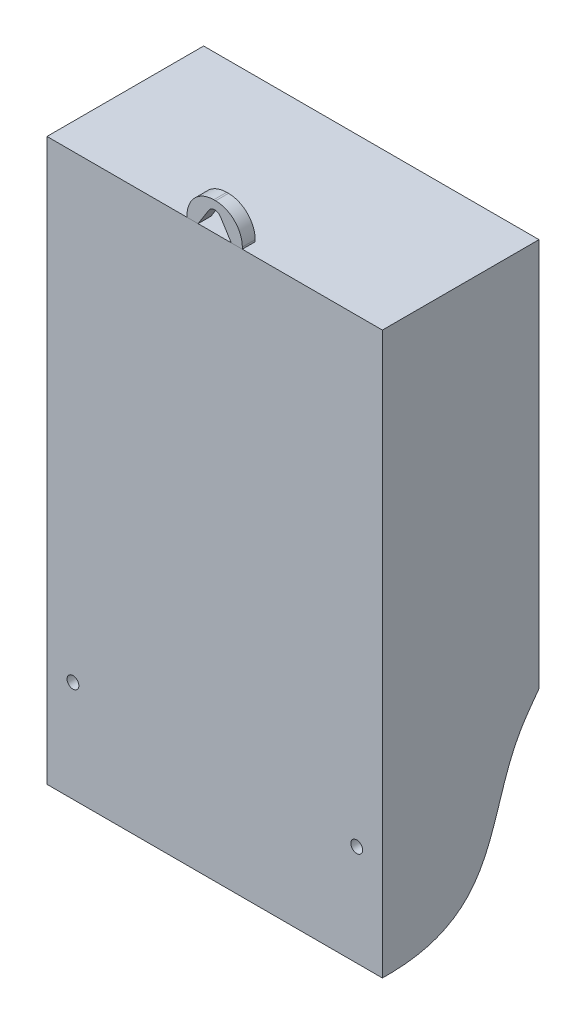
ISO-10303-21;
HEADER;
FILE_DESCRIPTION(('STEP AP214'),'2;1');
FILE_NAME('part.step','',(''),(''),'','','');
FILE_SCHEMA(('AUTOMOTIVE_DESIGN { 1 0 10303 214 1 1 1 1 }'));
ENDSEC;
DATA;
#1=APPLICATION_CONTEXT('core data for automotive mechanical design processes');
#2=APPLICATION_PROTOCOL_DEFINITION('international standard','automotive_design',2000,#1);
#3=PRODUCT_CONTEXT('',#1,'mechanical');
#4=PRODUCT('Part','Part','',(#3));
#5=PRODUCT_RELATED_PRODUCT_CATEGORY('part','',(#4));
#6=PRODUCT_DEFINITION_FORMATION('','',#4);
#7=PRODUCT_DEFINITION_CONTEXT('part definition',#1,'design');
#8=PRODUCT_DEFINITION('design','',#6,#7);
#9=PRODUCT_DEFINITION_SHAPE('','',#8);
#10=(LENGTH_UNIT() NAMED_UNIT(*) SI_UNIT(.MILLI.,.METRE.));
#11=(NAMED_UNIT(*) PLANE_ANGLE_UNIT() SI_UNIT($,.RADIAN.));
#12=(NAMED_UNIT(*) SI_UNIT($,.STERADIAN.) SOLID_ANGLE_UNIT());
#13=UNCERTAINTY_MEASURE_WITH_UNIT(LENGTH_MEASURE(1.E-05),#10,'distance_accuracy_value','');
#14=(GEOMETRIC_REPRESENTATION_CONTEXT(3) GLOBAL_UNCERTAINTY_ASSIGNED_CONTEXT((#13)) GLOBAL_UNIT_ASSIGNED_CONTEXT((#10,
#11,#12)) REPRESENTATION_CONTEXT('',''));
#15=CARTESIAN_POINT('',(0.,0.,0.));
#16=DIRECTION('',(0.,0.,1.));
#17=DIRECTION('',(1.,0.,0.));
#18=AXIS2_PLACEMENT_3D('',#15,#16,#17);
#19=CARTESIAN_POINT('',(-15.,152.25,78.));
#20=DIRECTION('',(0.,-1.,0.));
#21=DIRECTION('',(1.,0.,0.));
#22=AXIS2_PLACEMENT_3D('',#19,#20,#21);
#23=PLANE('',#22);
#24=DIRECTION('',(1.,0.,0.));
#25=VECTOR('',#24,1.);
#26=CARTESIAN_POINT('',(-15.,152.25,85.));
#27=LINE('',#26,#25);
#28=CARTESIAN_POINT('',(-15.,152.25,85.));
#29=VERTEX_POINT('',#28);
#30=CARTESIAN_POINT('',(-9.,152.25,85.));
#31=VERTEX_POINT('',#30);
#32=EDGE_CURVE('E162',#29,#31,#27,.T.);
#33=ORIENTED_EDGE('',*,*,#32,.F.);
#34=DIRECTION('',(0.,0.,1.));
#35=VECTOR('',#34,1.);
#36=CARTESIAN_POINT('',(-15.,152.25,78.));
#37=LINE('',#36,#35);
#38=CARTESIAN_POINT('',(-15.,152.25,78.));
#39=VERTEX_POINT('',#38);
#40=EDGE_CURVE('E12',#39,#29,#37,.T.);
#41=ORIENTED_EDGE('',*,*,#40,.F.);
#42=DIRECTION('',(1.,0.,0.));
#43=VECTOR('',#42,1.);
#44=CARTESIAN_POINT('',(-15.,152.25,78.));
#45=LINE('',#44,#43);
#46=CARTESIAN_POINT('',(-9.,152.25,78.));
#47=VERTEX_POINT('',#46);
#48=EDGE_CURVE('E188',#39,#47,#45,.T.);
#49=ORIENTED_EDGE('',*,*,#48,.T.);
#50=DIRECTION('',(0.,0.,1.));
#51=VECTOR('',#50,1.);
#52=CARTESIAN_POINT('',(-9.,152.25,78.));
#53=LINE('',#52,#51);
#54=EDGE_CURVE('E56',#47,#31,#53,.T.);
#55=ORIENTED_EDGE('',*,*,#54,.T.);
#56=EDGE_LOOP('',(#33,#41,#49,#55));
#57=FACE_BOUND('',#56,.T.);
#58=ADVANCED_FACE('F53',(#57),#23,.T.);
#59=CARTESIAN_POINT('',(-15.,153.25,78.));
#60=DIRECTION('',(-1.,0.,0.));
#61=DIRECTION('',(0.,0.,1.));
#62=AXIS2_PLACEMENT_3D('',#59,#60,#61);
#63=PLANE('',#62);
#64=DIRECTION('',(0.,-1.,0.));
#65=VECTOR('',#64,1.);
#66=CARTESIAN_POINT('',(-15.,153.25,85.));
#67=LINE('',#66,#65);
#68=CARTESIAN_POINT('',(-15.,153.25,85.));
#69=VERTEX_POINT('',#68);
#70=EDGE_CURVE('E186',#69,#29,#67,.T.);
#71=ORIENTED_EDGE('',*,*,#70,.F.);
#72=DIRECTION('',(0.,0.,1.));
#73=VECTOR('',#72,1.);
#74=CARTESIAN_POINT('',(-15.,153.25,78.));
#75=LINE('',#74,#73);
#76=CARTESIAN_POINT('',(-15.,153.25,78.));
#77=VERTEX_POINT('',#76);
#78=EDGE_CURVE('E62',#77,#69,#75,.T.);
#79=ORIENTED_EDGE('',*,*,#78,.F.);
#80=DIRECTION('',(0.,-1.,0.));
#81=VECTOR('',#80,1.);
#82=CARTESIAN_POINT('',(-15.,153.25,78.));
#83=LINE('',#82,#81);
#84=EDGE_CURVE('E152',#77,#39,#83,.T.);
#85=ORIENTED_EDGE('',*,*,#84,.T.);
#86=ORIENTED_EDGE('',*,*,#40,.T.);
#87=EDGE_LOOP('',(#71,#79,#85,#86));
#88=FACE_BOUND('',#87,.T.);
#89=ADVANCED_FACE('F204',(#88),#63,.T.);
#90=CARTESIAN_POINT('',(-0.499999999999999,153.25,78.));
#91=DIRECTION('',(0.,0.,1.));
#92=DIRECTION('',(1.,0.,0.));
#93=AXIS2_PLACEMENT_3D('',#90,#91,#92);
#94=CYLINDRICAL_SURFACE('',#93,14.5);
#95=CARTESIAN_POINT('',(-0.499999999999999,153.25,85.));
#96=DIRECTION('',(0.,0.,1.));
#97=DIRECTION('',(-1.,0.,0.));
#98=AXIS2_PLACEMENT_3D('',#95,#96,#97);
#99=CIRCLE('',#98,14.5);
#100=CARTESIAN_POINT('',(-0.499999999999897,167.75,85.));
#101=VERTEX_POINT('',#100);
#102=EDGE_CURVE('E139',#101,#69,#99,.T.);
#103=ORIENTED_EDGE('',*,*,#102,.F.);
#104=DIRECTION('',(0.,0.,1.));
#105=VECTOR('',#104,1.);
#106=CARTESIAN_POINT('',(-0.499999999999897,167.75,78.));
#107=LINE('',#106,#105);
#108=CARTESIAN_POINT('',(-0.499999999999897,167.75,78.));
#109=VERTEX_POINT('',#108);
#110=EDGE_CURVE('E134',#109,#101,#107,.T.);
#111=ORIENTED_EDGE('',*,*,#110,.F.);
#112=CARTESIAN_POINT('',(-0.499999999999999,153.25,78.));
#113=DIRECTION('',(0.,0.,1.));
#114=DIRECTION('',(-1.,0.,0.));
#115=AXIS2_PLACEMENT_3D('',#112,#113,#114);
#116=CIRCLE('',#115,14.5);
#117=EDGE_CURVE('E137',#109,#77,#116,.T.);
#118=ORIENTED_EDGE('',*,*,#117,.T.);
#119=ORIENTED_EDGE('',*,*,#78,.T.);
#120=EDGE_LOOP('',(#103,#111,#118,#119));
#121=FACE_BOUND('',#120,.T.);
#122=ADVANCED_FACE('F136',(#121),#94,.T.);
#123=CARTESIAN_POINT('',(0.499999999999896,167.75,78.));
#124=DIRECTION('',(0.,1.,0.));
#125=DIRECTION('',(0.,0.,1.));
#126=AXIS2_PLACEMENT_3D('',#123,#124,#125);
#127=PLANE('',#126);
#128=DIRECTION('',(-1.,0.,0.));
#129=VECTOR('',#128,1.);
#130=CARTESIAN_POINT('',(0.499999999999896,167.75,85.));
#131=LINE('',#130,#129);
#132=CARTESIAN_POINT('',(0.499999999999896,167.75,85.));
#133=VERTEX_POINT('',#132);
#134=EDGE_CURVE('E183',#133,#101,#131,.T.);
#135=ORIENTED_EDGE('',*,*,#134,.F.);
#136=DIRECTION('',(0.,0.,1.));
#137=VECTOR('',#136,1.);
#138=CARTESIAN_POINT('',(0.499999999999896,167.75,78.));
#139=LINE('',#138,#137);
#140=CARTESIAN_POINT('',(0.499999999999896,167.75,78.));
#141=VERTEX_POINT('',#140);
#142=EDGE_CURVE('E144',#141,#133,#139,.T.);
#143=ORIENTED_EDGE('',*,*,#142,.F.);
#144=DIRECTION('',(-1.,0.,0.));
#145=VECTOR('',#144,1.);
#146=CARTESIAN_POINT('',(0.499999999999896,167.75,78.));
#147=LINE('',#146,#145);
#148=EDGE_CURVE('E150',#141,#109,#147,.T.);
#149=ORIENTED_EDGE('',*,*,#148,.T.);
#150=ORIENTED_EDGE('',*,*,#110,.T.);
#151=EDGE_LOOP('',(#135,#143,#149,#150));
#152=FACE_BOUND('',#151,.T.);
#153=ADVANCED_FACE('F154',(#152),#127,.T.);
#154=CARTESIAN_POINT('',(0.499999999999999,153.25,78.));
#155=DIRECTION('',(0.,0.,1.));
#156=DIRECTION('',(1.,0.,0.));
#157=AXIS2_PLACEMENT_3D('',#154,#155,#156);
#158=CYLINDRICAL_SURFACE('',#157,14.5);
#159=CARTESIAN_POINT('',(0.499999999999999,153.25,85.));
#160=DIRECTION('',(0.,0.,1.));
#161=DIRECTION('',(1.,0.,0.));
#162=AXIS2_PLACEMENT_3D('',#159,#160,#161);
#163=CIRCLE('',#162,14.5);
#164=CARTESIAN_POINT('',(15.,153.25,85.));
#165=VERTEX_POINT('',#164);
#166=EDGE_CURVE('E180',#165,#133,#163,.T.);
#167=ORIENTED_EDGE('',*,*,#166,.F.);
#168=DIRECTION('',(0.,0.,1.));
#169=VECTOR('',#168,1.);
#170=CARTESIAN_POINT('',(15.,153.25,78.));
#171=LINE('',#170,#169);
#172=CARTESIAN_POINT('',(15.,153.25,78.));
#173=VERTEX_POINT('',#172);
#174=EDGE_CURVE('E192',#173,#165,#171,.T.);
#175=ORIENTED_EDGE('',*,*,#174,.F.);
#176=CARTESIAN_POINT('',(0.499999999999999,153.25,78.));
#177=DIRECTION('',(0.,0.,1.));
#178=DIRECTION('',(1.,0.,0.));
#179=AXIS2_PLACEMENT_3D('',#176,#177,#178);
#180=CIRCLE('',#179,14.5);
#181=EDGE_CURVE('E155',#173,#141,#180,.T.);
#182=ORIENTED_EDGE('',*,*,#181,.T.);
#183=ORIENTED_EDGE('',*,*,#142,.T.);
#184=EDGE_LOOP('',(#167,#175,#182,#183));
#185=FACE_BOUND('',#184,.T.);
#186=ADVANCED_FACE('F217',(#185),#158,.T.);
#187=CARTESIAN_POINT('',(15.,153.25,78.));
#188=DIRECTION('',(1.,0.,0.));
#189=DIRECTION('',(0.,0.,-1.));
#190=AXIS2_PLACEMENT_3D('',#187,#188,#189);
#191=PLANE('',#190);
#192=DIRECTION('',(0.,1.,0.));
#193=VECTOR('',#192,1.);
#194=CARTESIAN_POINT('',(15.,153.25,85.));
#195=LINE('',#194,#193);
#196=CARTESIAN_POINT('',(15.,152.25,85.));
#197=VERTEX_POINT('',#196);
#198=EDGE_CURVE('E177',#197,#165,#195,.T.);
#199=ORIENTED_EDGE('',*,*,#198,.F.);
#200=DIRECTION('',(0.,0.,1.));
#201=VECTOR('',#200,1.);
#202=CARTESIAN_POINT('',(15.,152.25,78.));
#203=LINE('',#202,#201);
#204=CARTESIAN_POINT('',(15.,152.25,78.));
#205=VERTEX_POINT('',#204);
#206=EDGE_CURVE('E194',#205,#197,#203,.T.);
#207=ORIENTED_EDGE('',*,*,#206,.F.);
#208=DIRECTION('',(0.,1.,0.));
#209=VECTOR('',#208,1.);
#210=CARTESIAN_POINT('',(15.,153.25,78.));
#211=LINE('',#210,#209);
#212=EDGE_CURVE('E157',#205,#173,#211,.T.);
#213=ORIENTED_EDGE('',*,*,#212,.T.);
#214=ORIENTED_EDGE('',*,*,#174,.T.);
#215=EDGE_LOOP('',(#199,#207,#213,#214));
#216=FACE_BOUND('',#215,.T.);
#217=ADVANCED_FACE('F220',(#216),#191,.T.);
#218=CARTESIAN_POINT('',(15.,152.25,78.));
#219=DIRECTION('',(0.,-1.,0.));
#220=DIRECTION('',(1.,0.,0.));
#221=AXIS2_PLACEMENT_3D('',#218,#219,#220);
#222=PLANE('',#221);
#223=DIRECTION('',(1.,0.,0.));
#224=VECTOR('',#223,1.);
#225=CARTESIAN_POINT('',(15.,152.25,85.));
#226=LINE('',#225,#224);
#227=CARTESIAN_POINT('',(9.,152.25,85.));
#228=VERTEX_POINT('',#227);
#229=EDGE_CURVE('E174',#228,#197,#226,.T.);
#230=ORIENTED_EDGE('',*,*,#229,.F.);
#231=DIRECTION('',(0.,0.,1.));
#232=VECTOR('',#231,1.);
#233=CARTESIAN_POINT('',(9.,152.25,78.));
#234=LINE('',#233,#232);
#235=CARTESIAN_POINT('',(9.,152.25,78.));
#236=VERTEX_POINT('',#235);
#237=EDGE_CURVE('E196',#236,#228,#234,.T.);
#238=ORIENTED_EDGE('',*,*,#237,.F.);
#239=DIRECTION('',(1.,0.,0.));
#240=VECTOR('',#239,1.);
#241=CARTESIAN_POINT('',(15.,152.25,78.));
#242=LINE('',#241,#240);
#243=EDGE_CURVE('E295',#236,#205,#242,.T.);
#244=ORIENTED_EDGE('',*,*,#243,.T.);
#245=ORIENTED_EDGE('',*,*,#206,.T.);
#246=EDGE_LOOP('',(#230,#238,#244,#245));
#247=FACE_BOUND('',#246,.T.);
#248=ADVANCED_FACE('F224',(#247),#222,.T.);
#249=CARTESIAN_POINT('',(9.,152.25,78.));
#250=DIRECTION('',(-0.846076857429282,-0.533060926463936,0.));
#251=DIRECTION('',(0.533060926463936,-0.846076857429282,0.));
#252=AXIS2_PLACEMENT_3D('',#249,#250,#251);
#253=PLANE('',#252);
#254=DIRECTION('',(0.533060926463936,-0.846076857429282,0.));
#255=VECTOR('',#254,1.);
#256=CARTESIAN_POINT('',(9.,152.25,85.));
#257=LINE('',#256,#255);
#258=CARTESIAN_POINT('',(3.17278821535982,161.49897847424,85.));
#259=VERTEX_POINT('',#258);
#260=EDGE_CURVE('E171',#259,#228,#257,.T.);
#261=ORIENTED_EDGE('',*,*,#260,.F.);
#262=DIRECTION('',(0.,0.,1.));
#263=VECTOR('',#262,1.);
#264=CARTESIAN_POINT('',(3.17278821535982,161.49897847424,78.));
#265=LINE('',#264,#263);
#266=CARTESIAN_POINT('',(3.17278821535982,161.49897847424,78.));
#267=VERTEX_POINT('',#266);
#268=EDGE_CURVE('E198',#267,#259,#265,.T.);
#269=ORIENTED_EDGE('',*,*,#268,.F.);
#270=DIRECTION('',(0.533060926463936,-0.846076857429282,0.));
#271=VECTOR('',#270,1.);
#272=CARTESIAN_POINT('',(9.,152.25,78.));
#273=LINE('',#272,#271);
#274=EDGE_CURVE('E291',#267,#236,#273,.T.);
#275=ORIENTED_EDGE('',*,*,#274,.T.);
#276=ORIENTED_EDGE('',*,*,#237,.T.);
#277=EDGE_LOOP('',(#261,#269,#275,#276));
#278=FACE_BOUND('',#277,.T.);
#279=ADVANCED_FACE('F228',(#278),#253,.T.);
#280=CARTESIAN_POINT('',(0.,159.5,78.));
#281=DIRECTION('',(0.,0.,1.));
#282=DIRECTION('',(1.,0.,0.));
#283=AXIS2_PLACEMENT_3D('',#280,#281,#282);
#284=CYLINDRICAL_SURFACE('',#283,3.75000000000001);
#285=CARTESIAN_POINT('',(0.,159.5,85.));
#286=DIRECTION('',(0.,0.,-1.));
#287=DIRECTION('',(1.,0.,0.));
#288=AXIS2_PLACEMENT_3D('',#285,#286,#287);
#289=CIRCLE('',#288,3.75000000000001);
#290=CARTESIAN_POINT('',(-3.17278821535982,161.49897847424,85.));
#291=VERTEX_POINT('',#290);
#292=EDGE_CURVE('E168',#291,#259,#289,.T.);
#293=ORIENTED_EDGE('',*,*,#292,.F.);
#294=DIRECTION('',(0.,0.,1.));
#295=VECTOR('',#294,1.);
#296=CARTESIAN_POINT('',(-3.17278821535982,161.49897847424,78.));
#297=LINE('',#296,#295);
#298=CARTESIAN_POINT('',(-3.17278821535982,161.49897847424,78.));
#299=VERTEX_POINT('',#298);
#300=EDGE_CURVE('E199',#299,#291,#297,.T.);
#301=ORIENTED_EDGE('',*,*,#300,.F.);
#302=CARTESIAN_POINT('',(0.,159.5,78.));
#303=DIRECTION('',(0.,0.,-1.));
#304=DIRECTION('',(1.,0.,0.));
#305=AXIS2_PLACEMENT_3D('',#302,#303,#304);
#306=CIRCLE('',#305,3.75000000000001);
#307=EDGE_CURVE('E302',#299,#267,#306,.T.);
#308=ORIENTED_EDGE('',*,*,#307,.T.);
#309=ORIENTED_EDGE('',*,*,#268,.T.);
#310=EDGE_LOOP('',(#293,#301,#308,#309));
#311=FACE_BOUND('',#310,.T.);
#312=ADVANCED_FACE('F232',(#311),#284,.F.);
#313=CARTESIAN_POINT('',(-9.,152.25,78.));
#314=DIRECTION('',(0.846076857429282,-0.533060926463936,0.));
#315=DIRECTION('',(0.533060926463936,0.846076857429282,0.));
#316=AXIS2_PLACEMENT_3D('',#313,#314,#315);
#317=PLANE('',#316);
#318=DIRECTION('',(0.533060926463936,0.846076857429282,0.));
#319=VECTOR('',#318,1.);
#320=CARTESIAN_POINT('',(-9.,152.25,85.));
#321=LINE('',#320,#319);
#322=EDGE_CURVE('E165',#31,#291,#321,.T.);
#323=ORIENTED_EDGE('',*,*,#322,.F.);
#324=ORIENTED_EDGE('',*,*,#54,.F.);
#325=DIRECTION('',(0.533060926463936,0.846076857429282,0.));
#326=VECTOR('',#325,1.);
#327=CARTESIAN_POINT('',(-9.,152.25,78.));
#328=LINE('',#327,#326);
#329=EDGE_CURVE('E304',#47,#299,#328,.T.);
#330=ORIENTED_EDGE('',*,*,#329,.T.);
#331=ORIENTED_EDGE('',*,*,#300,.T.);
#332=EDGE_LOOP('',(#323,#324,#330,#331));
#333=FACE_BOUND('',#332,.T.);
#334=ADVANCED_FACE('F201',(#333),#317,.T.);
#335=CARTESIAN_POINT('',(0.,159.5,78.));
#336=DIRECTION('',(0.,0.,1.));
#337=DIRECTION('',(1.,0.,0.));
#338=AXIS2_PLACEMENT_3D('',#335,#336,#337);
#339=PLANE('',#338);
#340=ORIENTED_EDGE('',*,*,#48,.F.);
#341=ORIENTED_EDGE('',*,*,#84,.F.);
#342=ORIENTED_EDGE('',*,*,#117,.F.);
#343=ORIENTED_EDGE('',*,*,#148,.F.);
#344=ORIENTED_EDGE('',*,*,#181,.F.);
#345=ORIENTED_EDGE('',*,*,#212,.F.);
#346=ORIENTED_EDGE('',*,*,#243,.F.);
#347=ORIENTED_EDGE('',*,*,#274,.F.);
#348=ORIENTED_EDGE('',*,*,#307,.F.);
#349=ORIENTED_EDGE('',*,*,#329,.F.);
#350=EDGE_LOOP('',(#340,#341,#342,#343,#344,#345,#346,#347,#348,#349));
#351=FACE_BOUND('',#350,.T.);
#352=ADVANCED_FACE('F148',(#351),#339,.F.);
#353=CARTESIAN_POINT('',(0.,159.5,85.));
#354=DIRECTION('',(0.,0.,1.));
#355=DIRECTION('',(1.,0.,0.));
#356=AXIS2_PLACEMENT_3D('',#353,#354,#355);
#357=PLANE('',#356);
#358=ORIENTED_EDGE('',*,*,#32,.T.);
#359=ORIENTED_EDGE('',*,*,#322,.T.);
#360=ORIENTED_EDGE('',*,*,#292,.T.);
#361=ORIENTED_EDGE('',*,*,#260,.T.);
#362=ORIENTED_EDGE('',*,*,#229,.T.);
#363=ORIENTED_EDGE('',*,*,#198,.T.);
#364=ORIENTED_EDGE('',*,*,#166,.T.);
#365=ORIENTED_EDGE('',*,*,#134,.T.);
#366=ORIENTED_EDGE('',*,*,#102,.T.);
#367=ORIENTED_EDGE('',*,*,#70,.T.);
#368=EDGE_LOOP('',(#358,#359,#360,#361,#362,#363,#364,#365,#366,#367));
#369=FACE_BOUND('',#368,.T.);
#370=ADVANCED_FACE('F203',(#369),#357,.T.);
#371=CLOSED_SHELL('',(#58,#89,#122,#153,#186,#217,#248,#279,#312,#334,#352,#370));
#372=MANIFOLD_SOLID_BREP('B2',#371);
#373=CARTESIAN_POINT('',(-91.,-152.25,85.));
#374=DIRECTION('',(1.,0.,0.));
#375=DIRECTION('',(0.,0.,-1.));
#376=AXIS2_PLACEMENT_3D('',#373,#374,#375);
#377=PLANE('',#376);
#378=CARTESIAN_POINT('',(-91.,-152.25,85.));
#379=CARTESIAN_POINT('',(-91.,-153.58284021929,21.2984316923289));
#380=CARTESIAN_POINT('',(-91.,-98.8700551935654,30.3152476346108));
#381=CARTESIAN_POINT('',(-91.,-63.8105896994976,3.64497707511076));
#382=CARTESIAN_POINT('',(-91.,-58.75,0.));
#383=B_SPLINE_CURVE_WITH_KNOTS('',3,(#378,#379,#380,#381,#382),.UNSPECIFIED.,.F.,.F.,(4,1,4),
(0.,0.856671901609483,1.),.UNSPECIFIED.);
#384=CARTESIAN_POINT('',(-91.,-152.25,79.816818668068));
#385=VERTEX_POINT('',#384);
#386=CARTESIAN_POINT('',(-91.,-58.75,0.));
#387=VERTEX_POINT('',#386);
#388=EDGE_CURVE('E335',#385,#387,#383,.T.);
#389=ORIENTED_EDGE('',*,*,#388,.F.);
#390=DIRECTION('',(0.,0.,-1.));
#391=VECTOR('',#390,1.);
#392=CARTESIAN_POINT('',(-91.,-152.25,85.));
#393=LINE('',#392,#391);
#394=CARTESIAN_POINT('',(-91.,-152.25,85.));
#395=VERTEX_POINT('',#394);
#396=EDGE_CURVE('E51',#395,#385,#393,.T.);
#397=ORIENTED_EDGE('',*,*,#396,.F.);
#398=DIRECTION('',(0.,-1.,0.));
#399=VECTOR('',#398,1.);
#400=CARTESIAN_POINT('',(-91.,-152.25,85.));
#401=LINE('',#400,#399);
#402=CARTESIAN_POINT('',(-91.,152.25,85.));
#403=VERTEX_POINT('',#402);
#404=EDGE_CURVE('E403',#403,#395,#401,.T.);
#405=ORIENTED_EDGE('',*,*,#404,.F.);
#406=DIRECTION('',(0.,0.,-1.));
#407=VECTOR('',#406,1.);
#408=CARTESIAN_POINT('',(-91.,152.25,85.));
#409=LINE('',#408,#407);
#410=CARTESIAN_POINT('',(-91.,152.25,0.));
#411=VERTEX_POINT('',#410);
#412=EDGE_CURVE('E389',#403,#411,#409,.T.);
#413=ORIENTED_EDGE('',*,*,#412,.T.);
#414=DIRECTION('',(0.,-1.,0.));
#415=VECTOR('',#414,1.);
#416=CARTESIAN_POINT('',(-91.,-152.25,0.));
#417=LINE('',#416,#415);
#418=EDGE_CURVE('E398',#411,#387,#417,.T.);
#419=ORIENTED_EDGE('',*,*,#418,.T.);
#420=EDGE_LOOP('',(#389,#397,#405,#413,#419));
#421=FACE_BOUND('',#420,.T.);
#422=ADVANCED_FACE('F309',(#421),#377,.F.);
#423=CARTESIAN_POINT('',(91.,-152.25,85.));
#424=DIRECTION('',(0.,1.,0.));
#425=DIRECTION('',(-1.,0.,0.));
#426=AXIS2_PLACEMENT_3D('',#423,#424,#425);
#427=PLANE('',#426);
#428=DIRECTION('',(1.,0.,0.));
#429=VECTOR('',#428,1.);
#430=CARTESIAN_POINT('',(-91.,-152.25,79.816818668068));
#431=LINE('',#430,#429);
#432=CARTESIAN_POINT('',(91.,-152.25,79.8168186680683));
#433=VERTEX_POINT('',#432);
#434=EDGE_CURVE('E354',#385,#433,#431,.T.);
#435=ORIENTED_EDGE('',*,*,#434,.T.);
#436=DIRECTION('',(0.,0.,-1.));
#437=VECTOR('',#436,1.);
#438=CARTESIAN_POINT('',(91.,-152.25,85.));
#439=LINE('',#438,#437);
#440=CARTESIAN_POINT('',(91.,-152.25,85.));
#441=VERTEX_POINT('',#440);
#442=EDGE_CURVE('E319',#441,#433,#439,.T.);
#443=ORIENTED_EDGE('',*,*,#442,.F.);
#444=DIRECTION('',(1.,0.,0.));
#445=VECTOR('',#444,1.);
#446=CARTESIAN_POINT('',(91.,-152.25,85.));
#447=LINE('',#446,#445);
#448=EDGE_CURVE('E376',#395,#441,#447,.T.);
#449=ORIENTED_EDGE('',*,*,#448,.F.);
#450=ORIENTED_EDGE('',*,*,#396,.T.);
#451=EDGE_LOOP('',(#435,#443,#449,#450));
#452=FACE_BOUND('',#451,.T.);
#453=ADVANCED_FACE('F406',(#452),#427,.F.);
#454=CARTESIAN_POINT('',(91.,-152.25,85.));
#455=DIRECTION('',(-1.,0.,0.));
#456=DIRECTION('',(0.,-1.,0.));
#457=AXIS2_PLACEMENT_3D('',#454,#455,#456);
#458=PLANE('',#457);
#459=CARTESIAN_POINT('',(91.,-152.25,79.8168186680684));
#460=CARTESIAN_POINT('',(91.,-150.970361607104,21.7103197903857));
#461=CARTESIAN_POINT('',(91.,-98.0294084238375,29.6757548049952));
#462=CARTESIAN_POINT('',(91.,-63.8105896994976,3.64497707511076));
#463=CARTESIAN_POINT('',(91.,-58.75,0.));
#464=B_SPLINE_CURVE_WITH_KNOTS('',3,(#459,#460,#461,#462,#463),.UNSPECIFIED.,.F.,.F.,(4,1,4),
(0.0239777406153026,0.856671901609483,1.),.UNSPECIFIED.);
#465=CARTESIAN_POINT('',(91.,-58.75,0.));
#466=VERTEX_POINT('',#465);
#467=EDGE_CURVE('E312',#433,#466,#464,.T.);
#468=ORIENTED_EDGE('',*,*,#467,.T.);
#469=DIRECTION('',(0.,1.,0.));
#470=VECTOR('',#469,1.);
#471=CARTESIAN_POINT('',(91.,-152.25,0.));
#472=LINE('',#471,#470);
#473=CARTESIAN_POINT('',(91.,152.25,0.));
#474=VERTEX_POINT('',#473);
#475=EDGE_CURVE('E385',#466,#474,#472,.T.);
#476=ORIENTED_EDGE('',*,*,#475,.T.);
#477=DIRECTION('',(0.,0.,-1.));
#478=VECTOR('',#477,1.);
#479=CARTESIAN_POINT('',(91.,152.25,85.));
#480=LINE('',#479,#478);
#481=CARTESIAN_POINT('',(91.,152.25,85.));
#482=VERTEX_POINT('',#481);
#483=EDGE_CURVE('E382',#482,#474,#480,.T.);
#484=ORIENTED_EDGE('',*,*,#483,.F.);
#485=DIRECTION('',(0.,1.,0.));
#486=VECTOR('',#485,1.);
#487=CARTESIAN_POINT('',(91.,-152.25,85.));
#488=LINE('',#487,#486);
#489=EDGE_CURVE('E369',#441,#482,#488,.T.);
#490=ORIENTED_EDGE('',*,*,#489,.F.);
#491=ORIENTED_EDGE('',*,*,#442,.T.);
#492=EDGE_LOOP('',(#468,#476,#484,#490,#491));
#493=FACE_BOUND('',#492,.T.);
#494=ADVANCED_FACE('F383',(#493),#458,.F.);
#495=CARTESIAN_POINT('',(0.,0.,0.));
#496=DIRECTION('',(0.,0.,1.));
#497=DIRECTION('',(1.,0.,0.));
#498=AXIS2_PLACEMENT_3D('',#495,#496,#497);
#499=PLANE('',#498);
#500=DIRECTION('',(-1.,0.,0.));
#501=VECTOR('',#500,1.);
#502=CARTESIAN_POINT('',(-81.0826052296068,29.341401959159,0.));
#503=LINE('',#502,#501);
#504=CARTESIAN_POINT('',(81.0826052296068,29.341401959159,0.));
#505=VERTEX_POINT('',#504);
#506=CARTESIAN_POINT('',(-81.0826052296068,29.341401959159,0.));
#507=VERTEX_POINT('',#506);
#508=EDGE_CURVE('E574',#505,#507,#503,.T.);
#509=ORIENTED_EDGE('',*,*,#508,.F.);
#510=DIRECTION('',(0.,-1.,0.));
#511=VECTOR('',#510,1.);
#512=CARTESIAN_POINT('',(81.0826052296068,29.341401959159,0.));
#513=LINE('',#512,#511);
#514=CARTESIAN_POINT('',(81.0826052296068,121.219708168345,0.));
#515=VERTEX_POINT('',#514);
#516=EDGE_CURVE('E326',#515,#505,#513,.T.);
#517=ORIENTED_EDGE('',*,*,#516,.F.);
#518=DIRECTION('',(1.,0.,0.));
#519=VECTOR('',#518,1.);
#520=CARTESIAN_POINT('',(-81.0826052296068,121.219708168345,0.));
#521=LINE('',#520,#519);
#522=CARTESIAN_POINT('',(-81.0826052296068,121.219708168345,0.));
#523=VERTEX_POINT('',#522);
#524=EDGE_CURVE('E562',#523,#515,#521,.T.);
#525=ORIENTED_EDGE('',*,*,#524,.F.);
#526=DIRECTION('',(0.,1.,0.));
#527=VECTOR('',#526,1.);
#528=CARTESIAN_POINT('',(-81.0826052296068,29.341401959159,0.));
#529=LINE('',#528,#527);
#530=EDGE_CURVE('E567',#507,#523,#529,.T.);
#531=ORIENTED_EDGE('',*,*,#530,.F.);
#532=EDGE_LOOP('',(#509,#517,#525,#531));
#533=FACE_BOUND('',#532,.T.);
#534=DIRECTION('',(1.,0.,0.));
#535=VECTOR('',#534,1.);
#536=CARTESIAN_POINT('',(-91.,-58.75,0.));
#537=LINE('',#536,#535);
#538=EDGE_CURVE('E349',#387,#466,#537,.T.);
#539=ORIENTED_EDGE('',*,*,#538,.F.);
#540=ORIENTED_EDGE('',*,*,#418,.F.);
#541=DIRECTION('',(-1.,0.,0.));
#542=VECTOR('',#541,1.);
#543=CARTESIAN_POINT('',(91.,152.25,0.));
#544=LINE('',#543,#542);
#545=EDGE_CURVE('E402',#474,#411,#544,.T.);
#546=ORIENTED_EDGE('',*,*,#545,.F.);
#547=ORIENTED_EDGE('',*,*,#475,.F.);
#548=EDGE_LOOP('',(#539,#540,#546,#547));
#549=FACE_BOUND('',#548,.T.);
#550=ADVANCED_FACE('F420',(#533,#549),#499,.F.);
#551=CARTESIAN_POINT('',(91.,152.25,85.));
#552=DIRECTION('',(0.,-1.,0.));
#553=DIRECTION('',(1.,0.,0.));
#554=AXIS2_PLACEMENT_3D('',#551,#552,#553);
#555=PLANE('',#554);
#556=ORIENTED_EDGE('',*,*,#545,.T.);
#557=ORIENTED_EDGE('',*,*,#412,.F.);
#558=DIRECTION('',(-1.,0.,0.));
#559=VECTOR('',#558,1.);
#560=CARTESIAN_POINT('',(91.,152.25,85.));
#561=LINE('',#560,#559);
#562=EDGE_CURVE('E374',#482,#403,#561,.T.);
#563=ORIENTED_EDGE('',*,*,#562,.F.);
#564=ORIENTED_EDGE('',*,*,#483,.T.);
#565=EDGE_LOOP('',(#556,#557,#563,#564));
#566=FACE_BOUND('',#565,.T.);
#567=ADVANCED_FACE('F391',(#566),#555,.F.);
#568=CARTESIAN_POINT('',(0.,0.,85.));
#569=DIRECTION('',(0.,0.,1.));
#570=DIRECTION('',(1.,0.,0.));
#571=AXIS2_PLACEMENT_3D('',#568,#569,#570);
#572=PLANE('',#571);
#573=CARTESIAN_POINT('',(77.0856408690832,-97.5,85.));
#574=DIRECTION('',(0.,0.,1.));
#575=DIRECTION('',(1.,0.,0.));
#576=AXIS2_PLACEMENT_3D('',#573,#574,#575);
#577=CIRCLE('',#576,3.19999999999999);
#578=CARTESIAN_POINT('',(80.2856408690832,-97.5,85.));
#579=VERTEX_POINT('',#578);
#580=EDGE_CURVE('E591',#579,#579,#577,.T.);
#581=ORIENTED_EDGE('',*,*,#580,.F.);
#582=EDGE_LOOP('',(#581));
#583=FACE_BOUND('',#582,.T.);
#584=CARTESIAN_POINT('',(-76.9141711429797,-97.2593752937312,85.));
#585=DIRECTION('',(0.,0.,1.));
#586=DIRECTION('',(-1.,0.,0.));
#587=AXIS2_PLACEMENT_3D('',#584,#585,#586);
#588=CIRCLE('',#587,3.19999999999999);
#589=CARTESIAN_POINT('',(-80.1141711429797,-97.2593752937312,85.));
#590=VERTEX_POINT('',#589);
#591=EDGE_CURVE('E581',#590,#590,#588,.T.);
#592=ORIENTED_EDGE('',*,*,#591,.F.);
#593=EDGE_LOOP('',(#592));
#594=FACE_BOUND('',#593,.T.);
#595=ORIENTED_EDGE('',*,*,#404,.T.);
#596=ORIENTED_EDGE('',*,*,#448,.T.);
#597=ORIENTED_EDGE('',*,*,#489,.T.);
#598=ORIENTED_EDGE('',*,*,#562,.T.);
#599=EDGE_LOOP('',(#595,#596,#597,#598));
#600=FACE_BOUND('',#599,.T.);
#601=ADVANCED_FACE('F372',(#583,#594,#600),#572,.T.);
#602=DIRECTION('',(1.,0.,0.));
#603=VECTOR('',#602,1.);
#604=SURFACE_OF_LINEAR_EXTRUSION('',#383,#603);
#605=ORIENTED_EDGE('',*,*,#467,.F.);
#606=ORIENTED_EDGE('',*,*,#434,.F.);
#607=ORIENTED_EDGE('',*,*,#388,.T.);
#608=ORIENTED_EDGE('',*,*,#538,.T.);
#609=EDGE_LOOP('',(#605,#606,#607,#608));
#610=FACE_BOUND('',#609,.T.);
#611=ADVANCED_FACE('F447',(#610),#604,.T.);
#612=CARTESIAN_POINT('',(-76.9141711429797,-97.2593752937312,80.));
#613=DIRECTION('',(0.,0.,1.));
#614=DIRECTION('',(1.,0.,0.));
#615=AXIS2_PLACEMENT_3D('',#612,#613,#614);
#616=CYLINDRICAL_SURFACE('',#615,3.19999999999999);
#617=CARTESIAN_POINT('',(-76.9141711429797,-97.2593752937312,80.));
#618=DIRECTION('',(0.,0.,1.));
#619=DIRECTION('',(-1.,0.,0.));
#620=AXIS2_PLACEMENT_3D('',#617,#618,#619);
#621=CIRCLE('',#620,3.19999999999999);
#622=CARTESIAN_POINT('',(-80.1141711429797,-97.2593752937312,80.));
#623=VERTEX_POINT('',#622);
#624=EDGE_CURVE('E594',#623,#623,#621,.T.);
#625=ORIENTED_EDGE('',*,*,#624,.F.);
#626=EDGE_LOOP('',(#625));
#627=FACE_BOUND('',#626,.T.);
#628=ORIENTED_EDGE('',*,*,#591,.T.);
#629=EDGE_LOOP('',(#628));
#630=FACE_BOUND('',#629,.T.);
#631=ADVANCED_FACE('F451',(#627,#630),#616,.F.);
#632=CARTESIAN_POINT('',(-76.9141711429797,-97.2593752937312,80.));
#633=DIRECTION('',(0.,0.,-1.));
#634=DIRECTION('',(-1.,0.,0.));
#635=AXIS2_PLACEMENT_3D('',#632,#633,#634);
#636=PLANE('',#635);
#637=ORIENTED_EDGE('',*,*,#624,.T.);
#638=EDGE_LOOP('',(#637));
#639=FACE_BOUND('',#638,.T.);
#640=ADVANCED_FACE('F465',(#639),#636,.F.);
#641=CARTESIAN_POINT('',(77.0856408690832,-97.5,80.));
#642=DIRECTION('',(0.,0.,1.));
#643=DIRECTION('',(1.,0.,0.));
#644=AXIS2_PLACEMENT_3D('',#641,#642,#643);
#645=CYLINDRICAL_SURFACE('',#644,3.19999999999999);
#646=CARTESIAN_POINT('',(77.0856408690832,-97.5,80.));
#647=DIRECTION('',(0.,0.,1.));
#648=DIRECTION('',(1.,0.,0.));
#649=AXIS2_PLACEMENT_3D('',#646,#647,#648);
#650=CIRCLE('',#649,3.19999999999999);
#651=CARTESIAN_POINT('',(80.2856408690832,-97.5,80.));
#652=VERTEX_POINT('',#651);
#653=EDGE_CURVE('E410',#652,#652,#650,.T.);
#654=ORIENTED_EDGE('',*,*,#653,.F.);
#655=EDGE_LOOP('',(#654));
#656=FACE_BOUND('',#655,.T.);
#657=ORIENTED_EDGE('',*,*,#580,.T.);
#658=EDGE_LOOP('',(#657));
#659=FACE_BOUND('',#658,.T.);
#660=ADVANCED_FACE('F473',(#656,#659),#645,.F.);
#661=CARTESIAN_POINT('',(77.0856408690832,-97.5,80.));
#662=DIRECTION('',(0.,0.,1.));
#663=DIRECTION('',(1.,0.,0.));
#664=AXIS2_PLACEMENT_3D('',#661,#662,#663);
#665=PLANE('',#664);
#666=ORIENTED_EDGE('',*,*,#653,.T.);
#667=EDGE_LOOP('',(#666));
#668=FACE_BOUND('',#667,.T.);
#669=ADVANCED_FACE('F480',(#668),#665,.T.);
#670=CARTESIAN_POINT('',(81.0826052296068,29.341401959159,0.1));
#671=DIRECTION('',(1.,0.,0.));
#672=DIRECTION('',(0.,0.,-1.));
#673=AXIS2_PLACEMENT_3D('',#670,#671,#672);
#674=PLANE('',#673);
#675=ORIENTED_EDGE('',*,*,#516,.T.);
#676=DIRECTION('',(0.,0.,-1.));
#677=VECTOR('',#676,1.);
#678=CARTESIAN_POINT('',(81.0826052296068,29.341401959159,0.1));
#679=LINE('',#678,#677);
#680=CARTESIAN_POINT('',(81.0826052296068,29.341401959159,0.1));
#681=VERTEX_POINT('',#680);
#682=EDGE_CURVE('E572',#681,#505,#679,.T.);
#683=ORIENTED_EDGE('',*,*,#682,.F.);
#684=DIRECTION('',(0.,-1.,0.));
#685=VECTOR('',#684,1.);
#686=CARTESIAN_POINT('',(81.0826052296068,29.341401959159,0.1));
#687=LINE('',#686,#685);
#688=CARTESIAN_POINT('',(81.0826052296068,121.219708168345,0.1));
#689=VERTEX_POINT('',#688);
#690=EDGE_CURVE('E554',#689,#681,#687,.T.);
#691=ORIENTED_EDGE('',*,*,#690,.F.);
#692=DIRECTION('',(0.,0.,-1.));
#693=VECTOR('',#692,1.);
#694=CARTESIAN_POINT('',(81.0826052296068,121.219708168345,0.1));
#695=LINE('',#694,#693);
#696=EDGE_CURVE('E579',#689,#515,#695,.T.);
#697=ORIENTED_EDGE('',*,*,#696,.T.);
#698=EDGE_LOOP('',(#675,#683,#691,#697));
#699=FACE_BOUND('',#698,.T.);
#700=ADVANCED_FACE('F487',(#699),#674,.F.);
#701=CARTESIAN_POINT('',(-81.0826052296068,121.219708168345,0.1));
#702=DIRECTION('',(0.,1.,0.));
#703=DIRECTION('',(0.,0.,1.));
#704=AXIS2_PLACEMENT_3D('',#701,#702,#703);
#705=PLANE('',#704);
#706=ORIENTED_EDGE('',*,*,#524,.T.);
#707=ORIENTED_EDGE('',*,*,#696,.F.);
#708=DIRECTION('',(1.,0.,0.));
#709=VECTOR('',#708,1.);
#710=CARTESIAN_POINT('',(-81.0826052296068,121.219708168345,0.1));
#711=LINE('',#710,#709);
#712=CARTESIAN_POINT('',(-81.0826052296068,121.219708168345,0.1));
#713=VERTEX_POINT('',#712);
#714=EDGE_CURVE('E560',#713,#689,#711,.T.);
#715=ORIENTED_EDGE('',*,*,#714,.F.);
#716=DIRECTION('',(0.,0.,-1.));
#717=VECTOR('',#716,1.);
#718=CARTESIAN_POINT('',(-81.0826052296068,121.219708168345,0.1));
#719=LINE('',#718,#717);
#720=EDGE_CURVE('E582',#713,#523,#719,.T.);
#721=ORIENTED_EDGE('',*,*,#720,.T.);
#722=EDGE_LOOP('',(#706,#707,#715,#721));
#723=FACE_BOUND('',#722,.T.);
#724=ADVANCED_FACE('F497',(#723),#705,.F.);
#725=CARTESIAN_POINT('',(-81.0826052296068,29.341401959159,0.1));
#726=DIRECTION('',(-1.,0.,0.));
#727=DIRECTION('',(0.,0.,1.));
#728=AXIS2_PLACEMENT_3D('',#725,#726,#727);
#729=PLANE('',#728);
#730=ORIENTED_EDGE('',*,*,#530,.T.);
#731=ORIENTED_EDGE('',*,*,#720,.F.);
#732=DIRECTION('',(0.,1.,0.));
#733=VECTOR('',#732,1.);
#734=CARTESIAN_POINT('',(-81.0826052296068,29.341401959159,0.1));
#735=LINE('',#734,#733);
#736=CARTESIAN_POINT('',(-81.0826052296068,29.341401959159,0.1));
#737=VERTEX_POINT('',#736);
#738=EDGE_CURVE('E564',#737,#713,#735,.T.);
#739=ORIENTED_EDGE('',*,*,#738,.F.);
#740=DIRECTION('',(0.,0.,-1.));
#741=VECTOR('',#740,1.);
#742=CARTESIAN_POINT('',(-81.0826052296068,29.341401959159,0.1));
#743=LINE('',#742,#741);
#744=EDGE_CURVE('E585',#737,#507,#743,.T.);
#745=ORIENTED_EDGE('',*,*,#744,.T.);
#746=EDGE_LOOP('',(#730,#731,#739,#745));
#747=FACE_BOUND('',#746,.T.);
#748=ADVANCED_FACE('F506',(#747),#729,.F.);
#749=CARTESIAN_POINT('',(-81.0826052296068,29.341401959159,0.1));
#750=DIRECTION('',(0.,-1.,0.));
#751=DIRECTION('',(1.,0.,0.));
#752=AXIS2_PLACEMENT_3D('',#749,#750,#751);
#753=PLANE('',#752);
#754=ORIENTED_EDGE('',*,*,#508,.T.);
#755=ORIENTED_EDGE('',*,*,#744,.F.);
#756=DIRECTION('',(-1.,0.,0.));
#757=VECTOR('',#756,1.);
#758=CARTESIAN_POINT('',(-81.0826052296068,29.341401959159,0.1));
#759=LINE('',#758,#757);
#760=EDGE_CURVE('E558',#681,#737,#759,.T.);
#761=ORIENTED_EDGE('',*,*,#760,.F.);
#762=ORIENTED_EDGE('',*,*,#682,.T.);
#763=EDGE_LOOP('',(#754,#755,#761,#762));
#764=FACE_BOUND('',#763,.T.);
#765=ADVANCED_FACE('F516',(#764),#753,.F.);
#766=CARTESIAN_POINT('',(0.,0.,0.1));
#767=DIRECTION('',(0.,0.,-1.));
#768=DIRECTION('',(-1.,0.,0.));
#769=AXIS2_PLACEMENT_3D('',#766,#767,#768);
#770=PLANE('',#769);
#771=ORIENTED_EDGE('',*,*,#690,.T.);
#772=ORIENTED_EDGE('',*,*,#760,.T.);
#773=ORIENTED_EDGE('',*,*,#738,.T.);
#774=ORIENTED_EDGE('',*,*,#714,.T.);
#775=EDGE_LOOP('',(#771,#772,#773,#774));
#776=FACE_BOUND('',#775,.T.);
#777=ADVANCED_FACE('F526',(#776),#770,.T.);
#778=CLOSED_SHELL('',(#422,#453,#494,#550,#567,#601,#611,#631,#640,#660,#669,#700,#724,#748,
#765,#777));
#779=MANIFOLD_SOLID_BREP('B6',#778);
#780=ADVANCED_BREP_SHAPE_REPRESENTATION('',(#18,#372,#779),#14);
#781=SHAPE_DEFINITION_REPRESENTATION(#9,#780);
ENDSEC;
END-ISO-10303-21;
